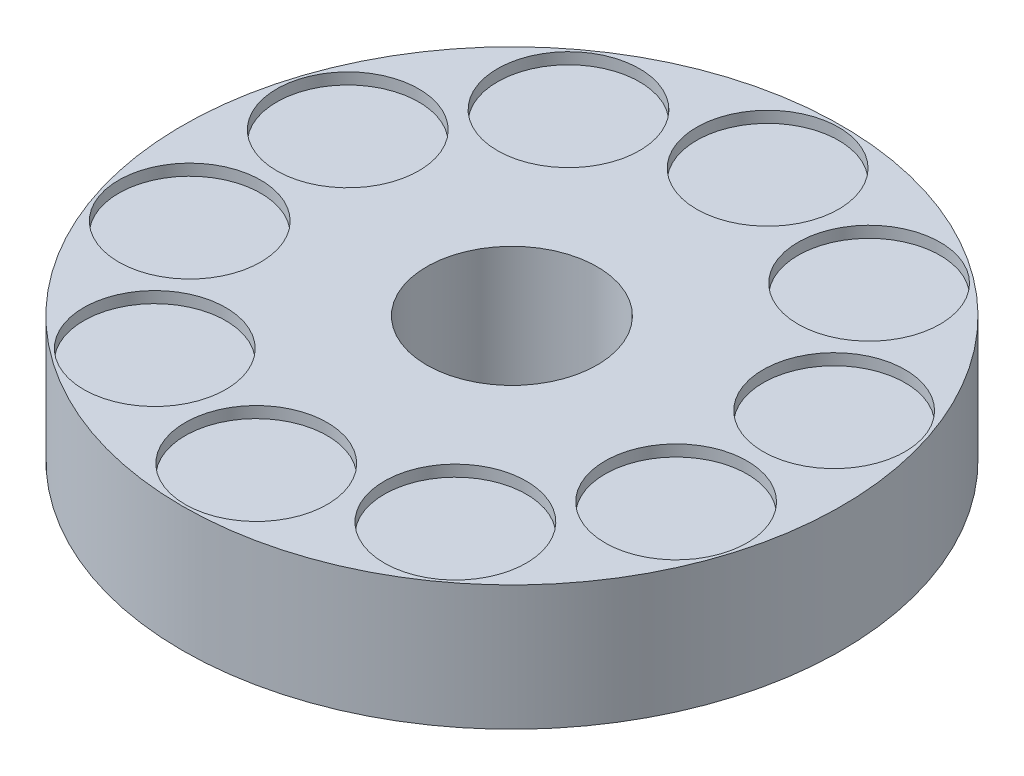
ISO-10303-21;
HEADER;
FILE_DESCRIPTION(('STEP AP214'),'2;1');
FILE_NAME('part.step','',(''),(''),'','','');
FILE_SCHEMA(('AUTOMOTIVE_DESIGN { 1 0 10303 214 1 1 1 1 }'));
ENDSEC;
DATA;
#1=APPLICATION_CONTEXT('core data for automotive mechanical design processes');
#2=APPLICATION_PROTOCOL_DEFINITION('international standard','automotive_design',2000,#1);
#3=PRODUCT_CONTEXT('',#1,'mechanical');
#4=PRODUCT('Part','Part','',(#3));
#5=PRODUCT_RELATED_PRODUCT_CATEGORY('part','',(#4));
#6=PRODUCT_DEFINITION_FORMATION('','',#4);
#7=PRODUCT_DEFINITION_CONTEXT('part definition',#1,'design');
#8=PRODUCT_DEFINITION('design','',#6,#7);
#9=PRODUCT_DEFINITION_SHAPE('','',#8);
#10=(LENGTH_UNIT() NAMED_UNIT(*) SI_UNIT(.MILLI.,.METRE.));
#11=(NAMED_UNIT(*) PLANE_ANGLE_UNIT() SI_UNIT($,.RADIAN.));
#12=(NAMED_UNIT(*) SI_UNIT($,.STERADIAN.) SOLID_ANGLE_UNIT());
#13=UNCERTAINTY_MEASURE_WITH_UNIT(LENGTH_MEASURE(1.E-05),#10,'distance_accuracy_value','');
#14=(GEOMETRIC_REPRESENTATION_CONTEXT(3) GLOBAL_UNCERTAINTY_ASSIGNED_CONTEXT((#13)) GLOBAL_UNIT_ASSIGNED_CONTEXT((#10,
#11,#12)) REPRESENTATION_CONTEXT('',''));
#15=CARTESIAN_POINT('',(0.,0.,0.));
#16=DIRECTION('',(0.,0.,1.));
#17=DIRECTION('',(1.,0.,0.));
#18=AXIS2_PLACEMENT_3D('',#15,#16,#17);
#19=CARTESIAN_POINT('',(0.,6.99999999999999,18.));
#20=DIRECTION('',(0.,-1.,0.));
#21=DIRECTION('',(0.,0.,-1.));
#22=AXIS2_PLACEMENT_3D('',#19,#20,#21);
#23=PLANE('',#22);
#24=CARTESIAN_POINT('',(0.,6.99999999999999,0.));
#25=DIRECTION('',(0.,1.,0.));
#26=DIRECTION('',(0.,0.,1.));
#27=AXIS2_PLACEMENT_3D('',#24,#25,#26);
#28=CIRCLE('',#27,55.);
#29=CARTESIAN_POINT('',(0.,6.99999999999999,55.));
#30=VERTEX_POINT('',#29);
#31=EDGE_CURVE('E357',#30,#30,#28,.T.);
#32=ORIENTED_EDGE('',*,*,#31,.F.);
#33=EDGE_LOOP('',(#32));
#34=FACE_BOUND('',#33,.T.);
#35=DIRECTION('',(0.50000000000001,0.,0.866025403784433));
#36=VECTOR('',#35,1.);
#37=CARTESIAN_POINT('',(-18.2910587012895,6.99999999999999,28.560347664953));
#38=LINE('',#37,#36);
#39=CARTESIAN_POINT('',(-26.8352873353496,7.,13.7613095592766));
#40=VERTEX_POINT('',#39);
#41=CARTESIAN_POINT('',(-25.3352873353496,6.99999999999999,16.3593857706299));
#42=VERTEX_POINT('',#41);
#43=EDGE_CURVE('E48',#40,#42,#38,.T.);
#44=ORIENTED_EDGE('',*,*,#43,.T.);
#45=DIRECTION('',(0.866025403784433,0.,-0.50000000000001));
#46=VECTOR('',#45,1.);
#47=CARTESIAN_POINT('',(-7.04422863406003,6.99999999999999,5.79903810567683));
#48=LINE('',#47,#46);
#49=CARTESIAN_POINT('',(-14.7842363829059,7.,10.2677336630029));
#50=VERTEX_POINT('',#49);
#51=EDGE_CURVE('E168',#42,#50,#48,.T.);
#52=ORIENTED_EDGE('',*,*,#51,.T.);
#53=CARTESIAN_POINT('',(0.,7.,0.));
#54=DIRECTION('',(0.,1.,0.));
#55=DIRECTION('',(0.,0.,1.));
#56=AXIS2_PLACEMENT_3D('',#53,#54,#55);
#57=CIRCLE('',#56,18.);
#58=CARTESIAN_POINT('',(-1.5,7.,17.9373911146521));
#59=VERTEX_POINT('',#58);
#60=EDGE_CURVE('E353',#50,#59,#57,.T.);
#61=ORIENTED_EDGE('',*,*,#60,.T.);
#62=DIRECTION('',(0.,0.,-1.));
#63=VECTOR('',#62,1.);
#64=CARTESIAN_POINT('',(-1.5,6.99999999999999,18.));
#65=LINE('',#64,#63);
#66=CARTESIAN_POINT('',(-1.5,6.99999999999999,30.1206953299058));
#67=VERTEX_POINT('',#66);
#68=EDGE_CURVE('E273',#67,#59,#65,.T.);
#69=ORIENTED_EDGE('',*,*,#68,.F.);
#70=DIRECTION('',(1.,0.,0.));
#71=VECTOR('',#70,1.);
#72=CARTESIAN_POINT('',(0.,6.99999999999999,30.1206953299058));
#73=LINE('',#72,#71);
#74=CARTESIAN_POINT('',(1.5,6.99999999999999,30.1206953299058));
#75=VERTEX_POINT('',#74);
#76=EDGE_CURVE('E282',#67,#75,#73,.T.);
#77=ORIENTED_EDGE('',*,*,#76,.T.);
#78=DIRECTION('',(0.,0.,-1.));
#79=VECTOR('',#78,1.);
#80=CARTESIAN_POINT('',(1.5,6.99999999999999,18.));
#81=LINE('',#80,#79);
#82=CARTESIAN_POINT('',(1.5,7.,17.9373911146521));
#83=VERTEX_POINT('',#82);
#84=EDGE_CURVE('E278',#75,#83,#81,.T.);
#85=ORIENTED_EDGE('',*,*,#84,.T.);
#86=CARTESIAN_POINT('',(14.784236382906,7.,10.2677336630027));
#87=VERTEX_POINT('',#86);
#88=EDGE_CURVE('E354',#83,#87,#57,.T.);
#89=ORIENTED_EDGE('',*,*,#88,.T.);
#90=DIRECTION('',(-0.86602540378444,0.,-0.499999999999998));
#91=VECTOR('',#90,1.);
#92=CARTESIAN_POINT('',(7.04422863405993,6.99999999999999,5.79903810567662));
#93=LINE('',#92,#91);
#94=CARTESIAN_POINT('',(25.3352873353498,7.,16.3593857706295));
#95=VERTEX_POINT('',#94);
#96=EDGE_CURVE('E253',#95,#87,#93,.T.);
#97=ORIENTED_EDGE('',*,*,#96,.F.);
#98=DIRECTION('',(0.499999999999998,0.,-0.86602540378444));
#99=VECTOR('',#98,1.);
#100=CARTESIAN_POINT('',(18.2910587012899,6.99999999999999,28.5603476649529));
#101=LINE('',#100,#99);
#102=CARTESIAN_POINT('',(26.8352873353498,6.99999999999999,13.7613095592762));
#103=VERTEX_POINT('',#102);
#104=EDGE_CURVE('E262',#95,#103,#101,.T.);
#105=ORIENTED_EDGE('',*,*,#104,.T.);
#106=DIRECTION('',(-0.86602540378444,0.,-0.499999999999998));
#107=VECTOR('',#106,1.);
#108=CARTESIAN_POINT('',(8.54422863405992,6.99999999999999,3.2009618943233));
#109=LINE('',#108,#107);
#110=CARTESIAN_POINT('',(16.284236382906,7.,7.66965745164935));
#111=VERTEX_POINT('',#110);
#112=EDGE_CURVE('E258',#103,#111,#109,.T.);
#113=ORIENTED_EDGE('',*,*,#112,.T.);
#114=CARTESIAN_POINT('',(16.2842363829059,7.,-7.66965745164946));
#115=VERTEX_POINT('',#114);
#116=EDGE_CURVE('E358',#111,#115,#57,.T.);
#117=ORIENTED_EDGE('',*,*,#116,.T.);
#118=DIRECTION('',(-0.866025403784436,0.,0.500000000000004));
#119=VECTOR('',#118,1.);
#120=CARTESIAN_POINT('',(-7.04422863405998,6.99999999999999,5.79903810567672));
#121=LINE('',#120,#119);
#122=CARTESIAN_POINT('',(26.8352873353497,6.99999999999999,-13.7613095592764));
#123=VERTEX_POINT('',#122);
#124=EDGE_CURVE('E233',#123,#115,#121,.T.);
#125=ORIENTED_EDGE('',*,*,#124,.F.);
#126=DIRECTION('',(-0.500000000000004,0.,-0.866025403784436));
#127=VECTOR('',#126,1.);
#128=CARTESIAN_POINT('',(33.8795159694097,6.99999999999999,-1.56034766495312));
#129=LINE('',#128,#127);
#130=CARTESIAN_POINT('',(25.3352873353497,6.99999999999999,-16.3593857706297));
#131=VERTEX_POINT('',#130);
#132=EDGE_CURVE('E242',#123,#131,#129,.T.);
#133=ORIENTED_EDGE('',*,*,#132,.T.);
#134=DIRECTION('',(-0.866025403784436,0.,0.500000000000004));
#135=VECTOR('',#134,1.);
#136=CARTESIAN_POINT('',(-8.54422863405999,6.99999999999999,3.20096189432341));
#137=LINE('',#136,#135);
#138=CARTESIAN_POINT('',(14.7842363829059,7.,-10.2677336630028));
#139=VERTEX_POINT('',#138);
#140=EDGE_CURVE('E238',#131,#139,#137,.T.);
#141=ORIENTED_EDGE('',*,*,#140,.T.);
#142=CARTESIAN_POINT('',(1.5,7.,-17.9373911146521));
#143=VERTEX_POINT('',#142);
#144=EDGE_CURVE('E553',#139,#143,#57,.T.);
#145=ORIENTED_EDGE('',*,*,#144,.T.);
#146=DIRECTION('',(0.,0.,1.));
#147=VECTOR('',#146,1.);
#148=CARTESIAN_POINT('',(1.5,6.99999999999999,18.));
#149=LINE('',#148,#147);
#150=CARTESIAN_POINT('',(1.5,6.99999999999999,-30.1206953299058));
#151=VERTEX_POINT('',#150);
#152=EDGE_CURVE('E213',#151,#143,#149,.T.);
#153=ORIENTED_EDGE('',*,*,#152,.F.);
#154=DIRECTION('',(-1.,0.,0.));
#155=VECTOR('',#154,1.);
#156=CARTESIAN_POINT('',(0.,6.99999999999999,-30.1206953299058));
#157=LINE('',#156,#155);
#158=CARTESIAN_POINT('',(-1.5,6.99999999999999,-30.1206953299058));
#159=VERTEX_POINT('',#158);
#160=EDGE_CURVE('E222',#151,#159,#157,.T.);
#161=ORIENTED_EDGE('',*,*,#160,.T.);
#162=DIRECTION('',(0.,0.,1.));
#163=VECTOR('',#162,1.);
#164=CARTESIAN_POINT('',(-1.5,6.99999999999999,18.));
#165=LINE('',#164,#163);
#166=CARTESIAN_POINT('',(-1.5,7.,-17.9373911146521));
#167=VERTEX_POINT('',#166);
#168=EDGE_CURVE('E218',#159,#167,#165,.T.);
#169=ORIENTED_EDGE('',*,*,#168,.T.);
#170=CARTESIAN_POINT('',(-14.7842363829061,7.,-10.2677336630026));
#171=VERTEX_POINT('',#170);
#172=EDGE_CURVE('E551',#167,#171,#57,.T.);
#173=ORIENTED_EDGE('',*,*,#172,.T.);
#174=DIRECTION('',(0.866025403784443,0.,0.499999999999992));
#175=VECTOR('',#174,1.);
#176=CARTESIAN_POINT('',(8.54422863405985,6.99999999999999,3.20096189432319));
#177=LINE('',#176,#175);
#178=CARTESIAN_POINT('',(-25.3352873353499,7.,-16.3593857706293));
#179=VERTEX_POINT('',#178);
#180=EDGE_CURVE('E193',#179,#171,#177,.T.);
#181=ORIENTED_EDGE('',*,*,#180,.F.);
#182=DIRECTION('',(-0.499999999999992,0.,0.866025403784443));
#183=VECTOR('',#182,1.);
#184=CARTESIAN_POINT('',(-33.8795159694098,6.99999999999999,-1.56034766495254));
#185=LINE('',#184,#183);
#186=CARTESIAN_POINT('',(-26.8352873353499,6.99999999999999,-13.761309559276));
#187=VERTEX_POINT('',#186);
#188=EDGE_CURVE('E202',#179,#187,#185,.T.);
#189=ORIENTED_EDGE('',*,*,#188,.T.);
#190=DIRECTION('',(0.866025403784443,0.,0.499999999999992));
#191=VECTOR('',#190,1.);
#192=CARTESIAN_POINT('',(7.04422863405987,6.99999999999999,5.79903810567652));
#193=LINE('',#192,#191);
#194=CARTESIAN_POINT('',(-16.284236382906,7.,-7.66965745164924));
#195=VERTEX_POINT('',#194);
#196=EDGE_CURVE('E198',#187,#195,#193,.T.);
#197=ORIENTED_EDGE('',*,*,#196,.T.);
#198=CARTESIAN_POINT('',(-16.2842363829059,7.,7.66965745164958));
#199=VERTEX_POINT('',#198);
#200=EDGE_CURVE('E550',#195,#199,#57,.T.);
#201=ORIENTED_EDGE('',*,*,#200,.T.);
#202=DIRECTION('',(0.866025403784433,0.,-0.50000000000001));
#203=VECTOR('',#202,1.);
#204=CARTESIAN_POINT('',(-8.54422863406006,6.99999999999999,3.20096189432353));
#205=LINE('',#204,#203);
#206=EDGE_CURVE('E53',#40,#199,#205,.T.);
#207=ORIENTED_EDGE('',*,*,#206,.F.);
#208=EDGE_LOOP('',(#44,#52,#61,#69,#77,#85,#89,#97,#105,#113,#117,#125,#133,#141,#145,#153,#161,
#169,#173,#181,#189,#197,#201,#207));
#209=FACE_BOUND('',#208,.T.);
#210=ADVANCED_FACE('F33',(#34,#209),#23,.T.);
#211=CARTESIAN_POINT('',(0.,42.6401700106534,0.));
#212=DIRECTION('',(0.,1.,0.));
#213=DIRECTION('',(0.,0.,1.));
#214=AXIS2_PLACEMENT_3D('',#211,#212,#213);
#215=CYLINDRICAL_SURFACE('',#214,18.);
#216=CARTESIAN_POINT('',(0.,-11.,0.));
#217=DIRECTION('',(0.,1.,0.));
#218=DIRECTION('',(0.,0.,1.));
#219=AXIS2_PLACEMENT_3D('',#216,#217,#218);
#220=CIRCLE('',#219,18.);
#221=CARTESIAN_POINT('',(0.,-11.,18.));
#222=VERTEX_POINT('',#221);
#223=EDGE_CURVE('E350',#222,#222,#220,.T.);
#224=ORIENTED_EDGE('',*,*,#223,.T.);
#225=EDGE_LOOP('',(#224));
#226=FACE_BOUND('',#225,.T.);
#227=ORIENTED_EDGE('',*,*,#60,.F.);
#228=DIRECTION('',(0.,1.,0.));
#229=VECTOR('',#228,1.);
#230=CARTESIAN_POINT('',(-14.7842363829059,42.6401700106534,10.2677336630029));
#231=LINE('',#230,#229);
#232=CARTESIAN_POINT('',(-14.7842363829059,-9.24440562033832,10.2677336630029));
#233=VERTEX_POINT('',#232);
#234=EDGE_CURVE('E163',#50,#233,#231,.F.);
#235=ORIENTED_EDGE('',*,*,#234,.T.);
#236=CARTESIAN_POINT('',(0.,-33.1609271065411,0.));
#237=DIRECTION('',(0.692820323027546,0.6,-0.400000000000008));
#238=DIRECTION('',(-0.51961524227066,0.8,0.300000000000006));
#239=AXIS2_PLACEMENT_3D('',#236,#237,#238);
#240=ELLIPSE('',#239,30.,18.);
#241=CARTESIAN_POINT('',(-16.2842363829059,-9.24440562033834,7.66965745164958));
#242=VERTEX_POINT('',#241);
#243=EDGE_CURVE('E156',#233,#242,#240,.F.);
#244=ORIENTED_EDGE('',*,*,#243,.T.);
#245=DIRECTION('',(0.,1.,0.));
#246=VECTOR('',#245,1.);
#247=CARTESIAN_POINT('',(-16.2842363829059,42.6401700106534,7.66965745164958));
#248=LINE('',#247,#246);
#249=EDGE_CURVE('E161',#199,#242,#248,.F.);
#250=ORIENTED_EDGE('',*,*,#249,.F.);
#251=ORIENTED_EDGE('',*,*,#200,.F.);
#252=DIRECTION('',(0.,1.,0.));
#253=VECTOR('',#252,1.);
#254=CARTESIAN_POINT('',(-16.284236382906,42.6401700106534,-7.66965745164924));
#255=LINE('',#254,#253);
#256=CARTESIAN_POINT('',(-16.2842363829061,-9.24440562033834,-7.66965745164924));
#257=VERTEX_POINT('',#256);
#258=EDGE_CURVE('E196',#195,#257,#255,.F.);
#259=ORIENTED_EDGE('',*,*,#258,.T.);
#260=CARTESIAN_POINT('',(0.,-33.1609271065411,0.));
#261=DIRECTION('',(0.692820323027555,0.6,0.399999999999994));
#262=DIRECTION('',(-0.519615242270666,0.8,-0.299999999999995));
#263=AXIS2_PLACEMENT_3D('',#260,#261,#262);
#264=ELLIPSE('',#263,30.,18.);
#265=CARTESIAN_POINT('',(-14.7842363829061,-9.24440562033834,-10.2677336630026));
#266=VERTEX_POINT('',#265);
#267=EDGE_CURVE('E200',#257,#266,#264,.F.);
#268=ORIENTED_EDGE('',*,*,#267,.T.);
#269=DIRECTION('',(0.,1.,0.));
#270=VECTOR('',#269,1.);
#271=CARTESIAN_POINT('',(-14.7842363829061,42.6401700106534,-10.2677336630026));
#272=LINE('',#271,#270);
#273=EDGE_CURVE('E188',#171,#266,#272,.F.);
#274=ORIENTED_EDGE('',*,*,#273,.F.);
#275=ORIENTED_EDGE('',*,*,#172,.F.);
#276=DIRECTION('',(0.,1.,0.));
#277=VECTOR('',#276,1.);
#278=CARTESIAN_POINT('',(-1.5,42.6401700106534,-17.9373911146521));
#279=LINE('',#278,#277);
#280=CARTESIAN_POINT('',(-1.5,-9.24440562033834,-17.9373911146521));
#281=VERTEX_POINT('',#280);
#282=EDGE_CURVE('E216',#167,#281,#279,.F.);
#283=ORIENTED_EDGE('',*,*,#282,.T.);
#284=CARTESIAN_POINT('',(0.,-33.1609271065411,0.));
#285=DIRECTION('',(0.,0.6,0.8));
#286=DIRECTION('',(0.,0.8,-0.6));
#287=AXIS2_PLACEMENT_3D('',#284,#285,#286);
#288=ELLIPSE('',#287,30.,18.);
#289=CARTESIAN_POINT('',(1.5,-9.24440562033835,-17.9373911146521));
#290=VERTEX_POINT('',#289);
#291=EDGE_CURVE('E220',#281,#290,#288,.F.);
#292=ORIENTED_EDGE('',*,*,#291,.T.);
#293=DIRECTION('',(0.,1.,0.));
#294=VECTOR('',#293,1.);
#295=CARTESIAN_POINT('',(1.5,42.6401700106534,-17.9373911146521));
#296=LINE('',#295,#294);
#297=EDGE_CURVE('E208',#143,#290,#296,.F.);
#298=ORIENTED_EDGE('',*,*,#297,.F.);
#299=ORIENTED_EDGE('',*,*,#144,.F.);
#300=DIRECTION('',(0.,1.,0.));
#301=VECTOR('',#300,1.);
#302=CARTESIAN_POINT('',(14.7842363829059,42.6401700106534,-10.2677336630028));
#303=LINE('',#302,#301);
#304=CARTESIAN_POINT('',(14.7842363829059,-9.24440562033833,-10.2677336630028));
#305=VERTEX_POINT('',#304);
#306=EDGE_CURVE('E236',#139,#305,#303,.F.);
#307=ORIENTED_EDGE('',*,*,#306,.T.);
#308=CARTESIAN_POINT('',(0.,-33.1609271065411,0.));
#309=DIRECTION('',(-0.692820323027549,0.6,0.400000000000003));
#310=DIRECTION('',(0.519615242270662,0.8,-0.300000000000002));
#311=AXIS2_PLACEMENT_3D('',#308,#309,#310);
#312=ELLIPSE('',#311,30.,18.);
#313=CARTESIAN_POINT('',(16.2842363829059,-9.24440562033835,-7.66965745164946));
#314=VERTEX_POINT('',#313);
#315=EDGE_CURVE('E240',#305,#314,#312,.F.);
#316=ORIENTED_EDGE('',*,*,#315,.T.);
#317=DIRECTION('',(0.,1.,0.));
#318=VECTOR('',#317,1.);
#319=CARTESIAN_POINT('',(16.2842363829059,42.6401700106534,-7.66965745164946));
#320=LINE('',#319,#318);
#321=EDGE_CURVE('E228',#115,#314,#320,.F.);
#322=ORIENTED_EDGE('',*,*,#321,.F.);
#323=ORIENTED_EDGE('',*,*,#116,.F.);
#324=DIRECTION('',(0.,1.,0.));
#325=VECTOR('',#324,1.);
#326=CARTESIAN_POINT('',(16.284236382906,42.6401700106534,7.66965745164935));
#327=LINE('',#326,#325);
#328=CARTESIAN_POINT('',(16.284236382906,-9.24440562033832,7.66965745164936));
#329=VERTEX_POINT('',#328);
#330=EDGE_CURVE('E256',#111,#329,#327,.F.);
#331=ORIENTED_EDGE('',*,*,#330,.T.);
#332=CARTESIAN_POINT('',(0.,-33.1609271065411,0.));
#333=DIRECTION('',(-0.692820323027552,0.6,-0.399999999999998));
#334=DIRECTION('',(0.519615242270664,0.8,0.299999999999999));
#335=AXIS2_PLACEMENT_3D('',#332,#333,#334);
#336=ELLIPSE('',#335,30.,18.);
#337=CARTESIAN_POINT('',(14.784236382906,-9.24440562033835,10.2677336630027));
#338=VERTEX_POINT('',#337);
#339=EDGE_CURVE('E260',#329,#338,#336,.F.);
#340=ORIENTED_EDGE('',*,*,#339,.T.);
#341=DIRECTION('',(0.,1.,0.));
#342=VECTOR('',#341,1.);
#343=CARTESIAN_POINT('',(14.784236382906,42.6401700106534,10.2677336630027));
#344=LINE('',#343,#342);
#345=EDGE_CURVE('E248',#87,#338,#344,.F.);
#346=ORIENTED_EDGE('',*,*,#345,.F.);
#347=ORIENTED_EDGE('',*,*,#88,.F.);
#348=DIRECTION('',(0.,1.,0.));
#349=VECTOR('',#348,1.);
#350=CARTESIAN_POINT('',(1.5,42.6401700106534,17.9373911146521));
#351=LINE('',#350,#349);
#352=CARTESIAN_POINT('',(1.5,-9.24440562033834,17.9373911146521));
#353=VERTEX_POINT('',#352);
#354=EDGE_CURVE('E276',#83,#353,#351,.F.);
#355=ORIENTED_EDGE('',*,*,#354,.T.);
#356=CARTESIAN_POINT('',(0.,-33.1609271065411,0.));
#357=DIRECTION('',(0.,0.6,-0.8));
#358=DIRECTION('',(0.,0.8,0.6));
#359=AXIS2_PLACEMENT_3D('',#356,#357,#358);
#360=ELLIPSE('',#359,30.,18.);
#361=CARTESIAN_POINT('',(-1.5,-9.24440562033835,17.9373911146521));
#362=VERTEX_POINT('',#361);
#363=EDGE_CURVE('E280',#353,#362,#360,.F.);
#364=ORIENTED_EDGE('',*,*,#363,.T.);
#365=DIRECTION('',(0.,1.,0.));
#366=VECTOR('',#365,1.);
#367=CARTESIAN_POINT('',(-1.5,42.6401700106534,17.9373911146521));
#368=LINE('',#367,#366);
#369=EDGE_CURVE('E268',#59,#362,#368,.F.);
#370=ORIENTED_EDGE('',*,*,#369,.F.);
#371=EDGE_LOOP('',(#227,#235,#244,#250,#251,#259,#268,#274,#275,#283,#292,#298,#299,#307,#316,
#322,#323,#331,#340,#346,#347,#355,#364,#370));
#372=FACE_BOUND('',#371,.T.);
#373=ADVANCED_FACE('F159',(#226,#372),#215,.T.);
#374=CARTESIAN_POINT('',(0.,42.6401700106534,0.));
#375=DIRECTION('',(0.,1.,0.));
#376=DIRECTION('',(0.,0.,1.));
#377=AXIS2_PLACEMENT_3D('',#374,#375,#376);
#378=CYLINDRICAL_SURFACE('',#377,58.);
#379=CARTESIAN_POINT('',(0.,-11.,0.));
#380=DIRECTION('',(0.,1.,0.));
#381=DIRECTION('',(0.,0.,1.));
#382=AXIS2_PLACEMENT_3D('',#379,#380,#381);
#383=CIRCLE('',#382,58.);
#384=CARTESIAN_POINT('',(0.,-11.,58.));
#385=VERTEX_POINT('',#384);
#386=EDGE_CURVE('E41',#385,#385,#383,.T.);
#387=ORIENTED_EDGE('',*,*,#386,.T.);
#388=EDGE_LOOP('',(#387));
#389=FACE_BOUND('',#388,.T.);
#390=CARTESIAN_POINT('',(0.,11.,0.));
#391=DIRECTION('',(0.,1.,0.));
#392=DIRECTION('',(0.,0.,1.));
#393=AXIS2_PLACEMENT_3D('',#390,#391,#392);
#394=CIRCLE('',#393,58.);
#395=CARTESIAN_POINT('',(0.,11.,58.));
#396=VERTEX_POINT('',#395);
#397=EDGE_CURVE('E11',#396,#396,#394,.T.);
#398=ORIENTED_EDGE('',*,*,#397,.F.);
#399=EDGE_LOOP('',(#398));
#400=FACE_BOUND('',#399,.T.);
#401=ADVANCED_FACE('F35',(#389,#400),#378,.T.);
#402=CARTESIAN_POINT('',(0.,-11.,58.));
#403=DIRECTION('',(0.,-1.,0.));
#404=DIRECTION('',(0.,0.,-1.));
#405=AXIS2_PLACEMENT_3D('',#402,#403,#404);
#406=PLANE('',#405);
#407=CARTESIAN_POINT('',(0.,-11.,0.));
#408=DIRECTION('',(0.,1.,0.));
#409=DIRECTION('',(0.,0.,1.));
#410=AXIS2_PLACEMENT_3D('',#407,#408,#409);
#411=CIRCLE('',#410,55.);
#412=CARTESIAN_POINT('',(0.,-11.,55.));
#413=VERTEX_POINT('',#412);
#414=EDGE_CURVE('E361',#413,#413,#411,.T.);
#415=ORIENTED_EDGE('',*,*,#414,.T.);
#416=EDGE_LOOP('',(#415));
#417=FACE_BOUND('',#416,.T.);
#418=ORIENTED_EDGE('',*,*,#386,.F.);
#419=EDGE_LOOP('',(#418));
#420=FACE_BOUND('',#419,.T.);
#421=ADVANCED_FACE('F368',(#417,#420),#406,.T.);
#422=CARTESIAN_POINT('',(0.,42.6401700106534,0.));
#423=DIRECTION('',(0.,1.,0.));
#424=DIRECTION('',(0.,0.,1.));
#425=AXIS2_PLACEMENT_3D('',#422,#423,#424);
#426=CYLINDRICAL_SURFACE('',#425,55.);
#427=ORIENTED_EDGE('',*,*,#31,.T.);
#428=EDGE_LOOP('',(#427));
#429=FACE_BOUND('',#428,.T.);
#430=ORIENTED_EDGE('',*,*,#414,.F.);
#431=EDGE_LOOP('',(#430));
#432=FACE_BOUND('',#431,.T.);
#433=ADVANCED_FACE('F370',(#429,#432),#426,.F.);
#434=CARTESIAN_POINT('',(0.,-11.,15.));
#435=DIRECTION('',(0.,-1.,0.));
#436=DIRECTION('',(0.,0.,-1.));
#437=AXIS2_PLACEMENT_3D('',#434,#435,#436);
#438=PLANE('',#437);
#439=CARTESIAN_POINT('',(0.,-11.,0.));
#440=DIRECTION('',(0.,1.,0.));
#441=DIRECTION('',(0.,0.,1.));
#442=AXIS2_PLACEMENT_3D('',#439,#440,#441);
#443=CIRCLE('',#442,15.);
#444=CARTESIAN_POINT('',(0.,-11.,15.));
#445=VERTEX_POINT('',#444);
#446=EDGE_CURVE('E347',#445,#445,#443,.T.);
#447=ORIENTED_EDGE('',*,*,#446,.T.);
#448=EDGE_LOOP('',(#447));
#449=FACE_BOUND('',#448,.T.);
#450=ORIENTED_EDGE('',*,*,#223,.F.);
#451=EDGE_LOOP('',(#450));
#452=FACE_BOUND('',#451,.T.);
#453=ADVANCED_FACE('F376',(#449,#452),#438,.T.);
#454=CARTESIAN_POINT('',(0.,42.6401700106534,0.));
#455=DIRECTION('',(0.,1.,0.));
#456=DIRECTION('',(0.,0.,1.));
#457=AXIS2_PLACEMENT_3D('',#454,#455,#456);
#458=CYLINDRICAL_SURFACE('',#457,15.);
#459=CARTESIAN_POINT('',(0.,11.,0.));
#460=DIRECTION('',(0.,1.,0.));
#461=DIRECTION('',(0.,0.,1.));
#462=AXIS2_PLACEMENT_3D('',#459,#460,#461);
#463=CIRCLE('',#462,15.);
#464=CARTESIAN_POINT('',(0.,11.,15.));
#465=VERTEX_POINT('',#464);
#466=EDGE_CURVE('E342',#465,#465,#463,.T.);
#467=ORIENTED_EDGE('',*,*,#466,.T.);
#468=EDGE_LOOP('',(#467));
#469=FACE_BOUND('',#468,.T.);
#470=ORIENTED_EDGE('',*,*,#446,.F.);
#471=EDGE_LOOP('',(#470));
#472=FACE_BOUND('',#471,.T.);
#473=ADVANCED_FACE('F391',(#469,#472),#458,.F.);
#474=CARTESIAN_POINT('',(0.,11.,45.));
#475=DIRECTION('',(0.,1.,0.));
#476=DIRECTION('',(0.,0.,1.));
#477=AXIS2_PLACEMENT_3D('',#474,#475,#476);
#478=PLANE('',#477);
#479=CARTESIAN_POINT('',(42.7975432332842,11.,-13.9057647468758));
#480=DIRECTION('',(0.,1.,0.));
#481=DIRECTION('',(0.,0.,1.));
#482=AXIS2_PLACEMENT_3D('',#479,#480,#481);
#483=CIRCLE('',#482,12.5);
#484=CARTESIAN_POINT('',(42.7975432332842,11.,-1.4057647468758));
#485=VERTEX_POINT('',#484);
#486=EDGE_CURVE('E295',#485,#485,#483,.T.);
#487=ORIENTED_EDGE('',*,*,#486,.F.);
#488=EDGE_LOOP('',(#487));
#489=FACE_BOUND('',#488,.T.);
#490=CARTESIAN_POINT('',(26.4503363531619,11.,-36.4057647468746));
#491=DIRECTION('',(0.,1.,0.));
#492=DIRECTION('',(0.,0.,1.));
#493=AXIS2_PLACEMENT_3D('',#490,#491,#492);
#494=CIRCLE('',#493,12.5);
#495=CARTESIAN_POINT('',(26.4503363531619,11.,-23.9057647468746));
#496=VERTEX_POINT('',#495);
#497=EDGE_CURVE('E294',#496,#496,#494,.T.);
#498=ORIENTED_EDGE('',*,*,#497,.F.);
#499=EDGE_LOOP('',(#498));
#500=FACE_BOUND('',#499,.T.);
#501=CARTESIAN_POINT('',(26.4503363531673,11.,36.4057647468707));
#502=DIRECTION('',(0.,1.,0.));
#503=DIRECTION('',(0.,0.,1.));
#504=AXIS2_PLACEMENT_3D('',#501,#502,#503);
#505=CIRCLE('',#504,12.5);
#506=CARTESIAN_POINT('',(26.4503363531673,11.,48.9057647468707));
#507=VERTEX_POINT('',#506);
#508=EDGE_CURVE('E309',#507,#507,#505,.T.);
#509=ORIENTED_EDGE('',*,*,#508,.F.);
#510=EDGE_LOOP('',(#509));
#511=FACE_BOUND('',#510,.T.);
#512=CARTESIAN_POINT('',(42.7975432332863,11.,13.9057647468695));
#513=DIRECTION('',(0.,1.,0.));
#514=DIRECTION('',(0.,0.,1.));
#515=AXIS2_PLACEMENT_3D('',#512,#513,#514);
#516=CIRCLE('',#515,12.5);
#517=CARTESIAN_POINT('',(42.7975432332863,11.,26.4057647468695));
#518=VERTEX_POINT('',#517);
#519=EDGE_CURVE('E308',#518,#518,#516,.T.);
#520=ORIENTED_EDGE('',*,*,#519,.F.);
#521=EDGE_LOOP('',(#520));
#522=FACE_BOUND('',#521,.T.);
#523=CARTESIAN_POINT('',(-42.7975432332796,11.,-13.9057647468695));
#524=DIRECTION('',(0.,1.,0.));
#525=DIRECTION('',(0.,0.,1.));
#526=AXIS2_PLACEMENT_3D('',#523,#524,#525);
#527=CIRCLE('',#526,12.5);
#528=CARTESIAN_POINT('',(-42.7975432332796,11.,-1.40576474686946));
#529=VERTEX_POINT('',#528);
#530=EDGE_CURVE('E288',#529,#529,#527,.T.);
#531=ORIENTED_EDGE('',*,*,#530,.F.);
#532=EDGE_LOOP('',(#531));
#533=FACE_BOUND('',#532,.T.);
#534=CARTESIAN_POINT('',(-42.7975432332776,11.,13.9057647468758));
#535=DIRECTION('',(0.,1.,0.));
#536=DIRECTION('',(0.,0.,1.));
#537=AXIS2_PLACEMENT_3D('',#534,#535,#536);
#538=CIRCLE('',#537,12.5);
#539=CARTESIAN_POINT('',(-42.7975432332776,11.,26.4057647468758));
#540=VERTEX_POINT('',#539);
#541=EDGE_CURVE('E321',#540,#540,#538,.T.);
#542=ORIENTED_EDGE('',*,*,#541,.F.);
#543=EDGE_LOOP('',(#542));
#544=FACE_BOUND('',#543,.T.);
#545=CARTESIAN_POINT('',(-26.4503363531553,11.,36.4057647468746));
#546=DIRECTION('',(0.,1.,0.));
#547=DIRECTION('',(0.,0.,1.));
#548=AXIS2_PLACEMENT_3D('',#545,#546,#547);
#549=CIRCLE('',#548,12.5);
#550=CARTESIAN_POINT('',(-26.4503363531553,11.,48.9057647468746));
#551=VERTEX_POINT('',#550);
#552=EDGE_CURVE('E320',#551,#551,#549,.T.);
#553=ORIENTED_EDGE('',*,*,#552,.F.);
#554=EDGE_LOOP('',(#553));
#555=FACE_BOUND('',#554,.T.);
#556=CARTESIAN_POINT('',(6.65358252734772E-12,11.,45.));
#557=DIRECTION('',(0.,1.,0.));
#558=DIRECTION('',(0.,0.,1.));
#559=AXIS2_PLACEMENT_3D('',#556,#557,#558);
#560=CIRCLE('',#559,12.5);
#561=CARTESIAN_POINT('',(6.65358252734772E-12,11.,57.5));
#562=VERTEX_POINT('',#561);
#563=EDGE_CURVE('E331',#562,#562,#560,.T.);
#564=ORIENTED_EDGE('',*,*,#563,.F.);
#565=EDGE_LOOP('',(#564));
#566=FACE_BOUND('',#565,.T.);
#567=CARTESIAN_POINT('',(-26.4503363531607,11.,-36.4057647468707));
#568=DIRECTION('',(0.,1.,0.));
#569=DIRECTION('',(0.,0.,1.));
#570=AXIS2_PLACEMENT_3D('',#567,#568,#569);
#571=CIRCLE('',#570,12.5);
#572=CARTESIAN_POINT('',(-26.4503363531607,11.,-23.9057647468707));
#573=VERTEX_POINT('',#572);
#574=EDGE_CURVE('E284',#573,#573,#571,.T.);
#575=ORIENTED_EDGE('',*,*,#574,.F.);
#576=EDGE_LOOP('',(#575));
#577=FACE_BOUND('',#576,.T.);
#578=CARTESIAN_POINT('',(0.,11.,-45.));
#579=DIRECTION('',(0.,1.,0.));
#580=DIRECTION('',(0.,0.,1.));
#581=AXIS2_PLACEMENT_3D('',#578,#579,#580);
#582=CIRCLE('',#581,12.5);
#583=CARTESIAN_POINT('',(0.,11.,-32.5));
#584=VERTEX_POINT('',#583);
#585=EDGE_CURVE('E302',#584,#584,#582,.T.);
#586=ORIENTED_EDGE('',*,*,#585,.F.);
#587=EDGE_LOOP('',(#586));
#588=FACE_BOUND('',#587,.T.);
#589=ORIENTED_EDGE('',*,*,#397,.T.);
#590=EDGE_LOOP('',(#589));
#591=FACE_BOUND('',#590,.T.);
#592=ORIENTED_EDGE('',*,*,#466,.F.);
#593=EDGE_LOOP('',(#592));
#594=FACE_BOUND('',#593,.T.);
#595=ADVANCED_FACE('F395',(#489,#500,#511,#522,#533,#544,#555,#566,#577,#588,#591,#594),#478,.T.);
#596=CARTESIAN_POINT('',(0.,8.99999999999999,-45.));
#597=DIRECTION('',(0.,1.,0.));
#598=DIRECTION('',(0.,0.,1.));
#599=AXIS2_PLACEMENT_3D('',#596,#597,#598);
#600=CYLINDRICAL_SURFACE('',#599,12.5);
#601=CARTESIAN_POINT('',(0.,8.99999999999999,-45.));
#602=DIRECTION('',(0.,1.,0.));
#603=DIRECTION('',(0.,0.,1.));
#604=AXIS2_PLACEMENT_3D('',#601,#602,#603);
#605=CIRCLE('',#604,12.5);
#606=CARTESIAN_POINT('',(0.,8.99999999999999,-32.5));
#607=VERTEX_POINT('',#606);
#608=EDGE_CURVE('E339',#607,#607,#605,.T.);
#609=ORIENTED_EDGE('',*,*,#608,.F.);
#610=EDGE_LOOP('',(#609));
#611=FACE_BOUND('',#610,.T.);
#612=ORIENTED_EDGE('',*,*,#585,.T.);
#613=EDGE_LOOP('',(#612));
#614=FACE_BOUND('',#613,.T.);
#615=ADVANCED_FACE('F399',(#611,#614),#600,.F.);
#616=CARTESIAN_POINT('',(0.,8.99999999999999,-45.));
#617=DIRECTION('',(0.,1.,0.));
#618=DIRECTION('',(0.,0.,1.));
#619=AXIS2_PLACEMENT_3D('',#616,#617,#618);
#620=PLANE('',#619);
#621=ORIENTED_EDGE('',*,*,#608,.T.);
#622=EDGE_LOOP('',(#621));
#623=FACE_BOUND('',#622,.T.);
#624=ADVANCED_FACE('F403',(#623),#620,.T.);
#625=CARTESIAN_POINT('',(-26.4503363531607,8.99999999999999,-36.4057647468707));
#626=DIRECTION('',(0.,1.,0.));
#627=DIRECTION('',(0.,0.,1.));
#628=AXIS2_PLACEMENT_3D('',#625,#626,#627);
#629=CYLINDRICAL_SURFACE('',#628,12.5);
#630=CARTESIAN_POINT('',(-26.4503363531607,8.99999999999999,-36.4057647468707));
#631=DIRECTION('',(0.,1.,0.));
#632=DIRECTION('',(0.,0.,1.));
#633=AXIS2_PLACEMENT_3D('',#630,#631,#632);
#634=CIRCLE('',#633,12.5);
#635=CARTESIAN_POINT('',(-26.4503363531607,8.99999999999999,-23.9057647468707));
#636=VERTEX_POINT('',#635);
#637=EDGE_CURVE('E285',#636,#636,#634,.T.);
#638=ORIENTED_EDGE('',*,*,#637,.F.);
#639=EDGE_LOOP('',(#638));
#640=FACE_BOUND('',#639,.T.);
#641=ORIENTED_EDGE('',*,*,#574,.T.);
#642=EDGE_LOOP('',(#641));
#643=FACE_BOUND('',#642,.T.);
#644=ADVANCED_FACE('F407',(#640,#643),#629,.F.);
#645=CARTESIAN_POINT('',(-26.4503363531607,8.99999999999999,-36.4057647468707));
#646=DIRECTION('',(0.,1.,0.));
#647=DIRECTION('',(0.,0.,1.));
#648=AXIS2_PLACEMENT_3D('',#645,#646,#647);
#649=PLANE('',#648);
#650=ORIENTED_EDGE('',*,*,#637,.T.);
#651=EDGE_LOOP('',(#650));
#652=FACE_BOUND('',#651,.T.);
#653=ADVANCED_FACE('F422',(#652),#649,.T.);
#654=CARTESIAN_POINT('',(6.65358252734772E-12,8.99999999999999,45.));
#655=DIRECTION('',(0.,1.,0.));
#656=DIRECTION('',(0.,0.,1.));
#657=AXIS2_PLACEMENT_3D('',#654,#655,#656);
#658=CYLINDRICAL_SURFACE('',#657,12.5);
#659=CARTESIAN_POINT('',(6.65358252734772E-12,8.99999999999999,45.));
#660=DIRECTION('',(0.,1.,0.));
#661=DIRECTION('',(0.,0.,1.));
#662=AXIS2_PLACEMENT_3D('',#659,#660,#661);
#663=CIRCLE('',#662,12.5);
#664=CARTESIAN_POINT('',(6.65358252734772E-12,8.99999999999999,57.5));
#665=VERTEX_POINT('',#664);
#666=EDGE_CURVE('E312',#665,#665,#663,.T.);
#667=ORIENTED_EDGE('',*,*,#666,.F.);
#668=EDGE_LOOP('',(#667));
#669=FACE_BOUND('',#668,.T.);
#670=ORIENTED_EDGE('',*,*,#563,.T.);
#671=EDGE_LOOP('',(#670));
#672=FACE_BOUND('',#671,.T.);
#673=ADVANCED_FACE('F419',(#669,#672),#658,.F.);
#674=CARTESIAN_POINT('',(6.65358252734772E-12,8.99999999999999,45.));
#675=DIRECTION('',(0.,1.,0.));
#676=DIRECTION('',(0.,0.,1.));
#677=AXIS2_PLACEMENT_3D('',#674,#675,#676);
#678=PLANE('',#677);
#679=ORIENTED_EDGE('',*,*,#666,.T.);
#680=EDGE_LOOP('',(#679));
#681=FACE_BOUND('',#680,.T.);
#682=ADVANCED_FACE('F413',(#681),#678,.T.);
#683=CARTESIAN_POINT('',(-26.4503363531553,8.99999999999999,36.4057647468746));
#684=DIRECTION('',(0.,1.,0.));
#685=DIRECTION('',(0.,0.,1.));
#686=AXIS2_PLACEMENT_3D('',#683,#684,#685);
#687=CYLINDRICAL_SURFACE('',#686,12.5);
#688=CARTESIAN_POINT('',(-26.4503363531553,8.99999999999999,36.4057647468746));
#689=DIRECTION('',(0.,1.,0.));
#690=DIRECTION('',(0.,0.,1.));
#691=AXIS2_PLACEMENT_3D('',#688,#689,#690);
#692=CIRCLE('',#691,12.5);
#693=CARTESIAN_POINT('',(-26.4503363531553,8.99999999999999,48.9057647468746));
#694=VERTEX_POINT('',#693);
#695=EDGE_CURVE('E334',#694,#694,#692,.T.);
#696=ORIENTED_EDGE('',*,*,#695,.F.);
#697=EDGE_LOOP('',(#696));
#698=FACE_BOUND('',#697,.T.);
#699=ORIENTED_EDGE('',*,*,#552,.T.);
#700=EDGE_LOOP('',(#699));
#701=FACE_BOUND('',#700,.T.);
#702=ADVANCED_FACE('F409',(#698,#701),#687,.F.);
#703=CARTESIAN_POINT('',(-26.4503363531553,8.99999999999999,36.4057647468746));
#704=DIRECTION('',(0.,1.,0.));
#705=DIRECTION('',(0.,0.,1.));
#706=AXIS2_PLACEMENT_3D('',#703,#704,#705);
#707=PLANE('',#706);
#708=ORIENTED_EDGE('',*,*,#695,.T.);
#709=EDGE_LOOP('',(#708));
#710=FACE_BOUND('',#709,.T.);
#711=ADVANCED_FACE('F412',(#710),#707,.T.);
#712=CARTESIAN_POINT('',(-42.7975432332776,8.99999999999999,13.9057647468758));
#713=DIRECTION('',(0.,1.,0.));
#714=DIRECTION('',(0.,0.,1.));
#715=AXIS2_PLACEMENT_3D('',#712,#713,#714);
#716=CYLINDRICAL_SURFACE('',#715,12.5);
#717=CARTESIAN_POINT('',(-42.7975432332776,8.99999999999999,13.9057647468758));
#718=DIRECTION('',(0.,1.,0.));
#719=DIRECTION('',(0.,0.,1.));
#720=AXIS2_PLACEMENT_3D('',#717,#718,#719);
#721=CIRCLE('',#720,12.5);
#722=CARTESIAN_POINT('',(-42.7975432332776,8.99999999999999,26.4057647468758));
#723=VERTEX_POINT('',#722);
#724=EDGE_CURVE('E317',#723,#723,#721,.T.);
#725=ORIENTED_EDGE('',*,*,#724,.F.);
#726=EDGE_LOOP('',(#725));
#727=FACE_BOUND('',#726,.T.);
#728=ORIENTED_EDGE('',*,*,#541,.T.);
#729=EDGE_LOOP('',(#728));
#730=FACE_BOUND('',#729,.T.);
#731=ADVANCED_FACE('F417',(#727,#730),#716,.F.);
#732=CARTESIAN_POINT('',(-42.7975432332776,8.99999999999999,13.9057647468758));
#733=DIRECTION('',(0.,1.,0.));
#734=DIRECTION('',(0.,0.,1.));
#735=AXIS2_PLACEMENT_3D('',#732,#733,#734);
#736=PLANE('',#735);
#737=ORIENTED_EDGE('',*,*,#724,.T.);
#738=EDGE_LOOP('',(#737));
#739=FACE_BOUND('',#738,.T.);
#740=ADVANCED_FACE('F431',(#739),#736,.T.);
#741=CARTESIAN_POINT('',(-42.7975432332796,8.99999999999999,-13.9057647468695));
#742=DIRECTION('',(0.,1.,0.));
#743=DIRECTION('',(0.,0.,1.));
#744=AXIS2_PLACEMENT_3D('',#741,#742,#743);
#745=CYLINDRICAL_SURFACE('',#744,12.5);
#746=CARTESIAN_POINT('',(-42.7975432332796,8.99999999999999,-13.9057647468695));
#747=DIRECTION('',(0.,1.,0.));
#748=DIRECTION('',(0.,0.,1.));
#749=AXIS2_PLACEMENT_3D('',#746,#747,#748);
#750=CIRCLE('',#749,12.5);
#751=CARTESIAN_POINT('',(-42.7975432332796,8.99999999999999,-1.40576474686946));
#752=VERTEX_POINT('',#751);
#753=EDGE_CURVE('E324',#752,#752,#750,.T.);
#754=ORIENTED_EDGE('',*,*,#753,.F.);
#755=EDGE_LOOP('',(#754));
#756=FACE_BOUND('',#755,.T.);
#757=ORIENTED_EDGE('',*,*,#530,.T.);
#758=EDGE_LOOP('',(#757));
#759=FACE_BOUND('',#758,.T.);
#760=ADVANCED_FACE('F427',(#756,#759),#745,.F.);
#761=CARTESIAN_POINT('',(-42.7975432332796,8.99999999999999,-13.9057647468695));
#762=DIRECTION('',(0.,1.,0.));
#763=DIRECTION('',(0.,0.,1.));
#764=AXIS2_PLACEMENT_3D('',#761,#762,#763);
#765=PLANE('',#764);
#766=ORIENTED_EDGE('',*,*,#753,.T.);
#767=EDGE_LOOP('',(#766));
#768=FACE_BOUND('',#767,.T.);
#769=ADVANCED_FACE('F430',(#768),#765,.T.);
#770=CARTESIAN_POINT('',(42.7975432332863,8.99999999999999,13.9057647468695));
#771=DIRECTION('',(0.,1.,0.));
#772=DIRECTION('',(0.,0.,1.));
#773=AXIS2_PLACEMENT_3D('',#770,#771,#772);
#774=CYLINDRICAL_SURFACE('',#773,12.5);
#775=CARTESIAN_POINT('',(42.7975432332863,8.99999999999999,13.9057647468695));
#776=DIRECTION('',(0.,1.,0.));
#777=DIRECTION('',(0.,0.,1.));
#778=AXIS2_PLACEMENT_3D('',#775,#776,#777);
#779=CIRCLE('',#778,12.5);
#780=CARTESIAN_POINT('',(42.7975432332863,8.99999999999999,26.4057647468695));
#781=VERTEX_POINT('',#780);
#782=EDGE_CURVE('E298',#781,#781,#779,.T.);
#783=ORIENTED_EDGE('',*,*,#782,.F.);
#784=EDGE_LOOP('',(#783));
#785=FACE_BOUND('',#784,.T.);
#786=ORIENTED_EDGE('',*,*,#519,.T.);
#787=EDGE_LOOP('',(#786));
#788=FACE_BOUND('',#787,.T.);
#789=ADVANCED_FACE('F435',(#785,#788),#774,.F.);
#790=CARTESIAN_POINT('',(42.7975432332863,8.99999999999999,13.9057647468695));
#791=DIRECTION('',(0.,1.,0.));
#792=DIRECTION('',(0.,0.,1.));
#793=AXIS2_PLACEMENT_3D('',#790,#791,#792);
#794=PLANE('',#793);
#795=ORIENTED_EDGE('',*,*,#782,.T.);
#796=EDGE_LOOP('',(#795));
#797=FACE_BOUND('',#796,.T.);
#798=ADVANCED_FACE('F445',(#797),#794,.T.);
#799=CARTESIAN_POINT('',(26.4503363531673,8.99999999999999,36.4057647468707));
#800=DIRECTION('',(0.,1.,0.));
#801=DIRECTION('',(0.,0.,1.));
#802=AXIS2_PLACEMENT_3D('',#799,#800,#801);
#803=CYLINDRICAL_SURFACE('',#802,12.5);
#804=CARTESIAN_POINT('',(26.4503363531673,8.99999999999999,36.4057647468707));
#805=DIRECTION('',(0.,1.,0.));
#806=DIRECTION('',(0.,0.,1.));
#807=AXIS2_PLACEMENT_3D('',#804,#805,#806);
#808=CIRCLE('',#807,12.5);
#809=CARTESIAN_POINT('',(26.4503363531673,8.99999999999999,48.9057647468707));
#810=VERTEX_POINT('',#809);
#811=EDGE_CURVE('E305',#810,#810,#808,.T.);
#812=ORIENTED_EDGE('',*,*,#811,.F.);
#813=EDGE_LOOP('',(#812));
#814=FACE_BOUND('',#813,.T.);
#815=ORIENTED_EDGE('',*,*,#508,.T.);
#816=EDGE_LOOP('',(#815));
#817=FACE_BOUND('',#816,.T.);
#818=ADVANCED_FACE('F449',(#814,#817),#803,.F.);
#819=CARTESIAN_POINT('',(26.4503363531673,8.99999999999999,36.4057647468707));
#820=DIRECTION('',(0.,1.,0.));
#821=DIRECTION('',(0.,0.,1.));
#822=AXIS2_PLACEMENT_3D('',#819,#820,#821);
#823=PLANE('',#822);
#824=ORIENTED_EDGE('',*,*,#811,.T.);
#825=EDGE_LOOP('',(#824));
#826=FACE_BOUND('',#825,.T.);
#827=ADVANCED_FACE('F453',(#826),#823,.T.);
#828=CARTESIAN_POINT('',(26.4503363531619,8.99999999999999,-36.4057647468746));
#829=DIRECTION('',(0.,1.,0.));
#830=DIRECTION('',(0.,0.,1.));
#831=AXIS2_PLACEMENT_3D('',#828,#829,#830);
#832=CYLINDRICAL_SURFACE('',#831,12.5);
#833=CARTESIAN_POINT('',(26.4503363531619,8.99999999999999,-36.4057647468746));
#834=DIRECTION('',(0.,1.,0.));
#835=DIRECTION('',(0.,0.,1.));
#836=AXIS2_PLACEMENT_3D('',#833,#834,#835);
#837=CIRCLE('',#836,12.5);
#838=CARTESIAN_POINT('',(26.4503363531619,8.99999999999999,-23.9057647468746));
#839=VERTEX_POINT('',#838);
#840=EDGE_CURVE('E299',#839,#839,#837,.T.);
#841=ORIENTED_EDGE('',*,*,#840,.F.);
#842=EDGE_LOOP('',(#841));
#843=FACE_BOUND('',#842,.T.);
#844=ORIENTED_EDGE('',*,*,#497,.T.);
#845=EDGE_LOOP('',(#844));
#846=FACE_BOUND('',#845,.T.);
#847=ADVANCED_FACE('F457',(#843,#846),#832,.F.);
#848=CARTESIAN_POINT('',(26.4503363531619,8.99999999999999,-36.4057647468746));
#849=DIRECTION('',(0.,1.,0.));
#850=DIRECTION('',(0.,0.,1.));
#851=AXIS2_PLACEMENT_3D('',#848,#849,#850);
#852=PLANE('',#851);
#853=ORIENTED_EDGE('',*,*,#840,.T.);
#854=EDGE_LOOP('',(#853));
#855=FACE_BOUND('',#854,.T.);
#856=ADVANCED_FACE('F461',(#855),#852,.T.);
#857=CARTESIAN_POINT('',(42.7975432332842,8.99999999999999,-13.9057647468758));
#858=DIRECTION('',(0.,1.,0.));
#859=DIRECTION('',(0.,0.,1.));
#860=AXIS2_PLACEMENT_3D('',#857,#858,#859);
#861=CYLINDRICAL_SURFACE('',#860,12.5);
#862=CARTESIAN_POINT('',(42.7975432332842,8.99999999999999,-13.9057647468758));
#863=DIRECTION('',(0.,1.,0.));
#864=DIRECTION('',(0.,0.,1.));
#865=AXIS2_PLACEMENT_3D('',#862,#863,#864);
#866=CIRCLE('',#865,12.5);
#867=CARTESIAN_POINT('',(42.7975432332842,8.99999999999999,-1.4057647468758));
#868=VERTEX_POINT('',#867);
#869=EDGE_CURVE('E291',#868,#868,#866,.T.);
#870=ORIENTED_EDGE('',*,*,#869,.F.);
#871=EDGE_LOOP('',(#870));
#872=FACE_BOUND('',#871,.T.);
#873=ORIENTED_EDGE('',*,*,#486,.T.);
#874=EDGE_LOOP('',(#873));
#875=FACE_BOUND('',#874,.T.);
#876=ADVANCED_FACE('F465',(#872,#875),#861,.F.);
#877=CARTESIAN_POINT('',(42.7975432332842,8.99999999999999,-13.9057647468758));
#878=DIRECTION('',(0.,1.,0.));
#879=DIRECTION('',(0.,0.,1.));
#880=AXIS2_PLACEMENT_3D('',#877,#878,#879);
#881=PLANE('',#880);
#882=ORIENTED_EDGE('',*,*,#869,.T.);
#883=EDGE_LOOP('',(#882));
#884=FACE_BOUND('',#883,.T.);
#885=ADVANCED_FACE('F469',(#884),#881,.T.);
#886=CARTESIAN_POINT('',(1.5,9.00000000000001,31.6206953299059));
#887=DIRECTION('',(0.,0.6,-0.8));
#888=DIRECTION('',(0.,0.8,0.6));
#889=AXIS2_PLACEMENT_3D('',#886,#887,#888);
#890=PLANE('',#889);
#891=ORIENTED_EDGE('',*,*,#76,.F.);
#892=DIRECTION('',(0.,-0.8,-0.6));
#893=VECTOR('',#892,1.);
#894=CARTESIAN_POINT('',(-1.5,9.00000000000001,31.6206953299059));
#895=LINE('',#894,#893);
#896=EDGE_CURVE('E264',#67,#362,#895,.T.);
#897=ORIENTED_EDGE('',*,*,#896,.T.);
#898=ORIENTED_EDGE('',*,*,#363,.F.);
#899=DIRECTION('',(0.,-0.8,-0.6));
#900=VECTOR('',#899,1.);
#901=CARTESIAN_POINT('',(1.5,9.00000000000001,31.6206953299059));
#902=LINE('',#901,#900);
#903=EDGE_CURVE('E265',#75,#353,#902,.T.);
#904=ORIENTED_EDGE('',*,*,#903,.F.);
#905=EDGE_LOOP('',(#891,#897,#898,#904));
#906=FACE_BOUND('',#905,.T.);
#907=ADVANCED_FACE('F473',(#906),#890,.F.);
#908=CARTESIAN_POINT('',(1.5,0.,0.));
#909=DIRECTION('',(-1.,0.,0.));
#910=DIRECTION('',(0.,0.,1.));
#911=AXIS2_PLACEMENT_3D('',#908,#909,#910);
#912=PLANE('',#911);
#913=ORIENTED_EDGE('',*,*,#84,.F.);
#914=ORIENTED_EDGE('',*,*,#903,.T.);
#915=ORIENTED_EDGE('',*,*,#354,.F.);
#916=EDGE_LOOP('',(#913,#914,#915));
#917=FACE_BOUND('',#916,.T.);
#918=ADVANCED_FACE('F483',(#917),#912,.F.);
#919=CARTESIAN_POINT('',(-1.5,0.,0.));
#920=DIRECTION('',(-1.,0.,0.));
#921=DIRECTION('',(0.,0.,1.));
#922=AXIS2_PLACEMENT_3D('',#919,#920,#921);
#923=PLANE('',#922);
#924=ORIENTED_EDGE('',*,*,#896,.F.);
#925=ORIENTED_EDGE('',*,*,#68,.T.);
#926=ORIENTED_EDGE('',*,*,#369,.T.);
#927=EDGE_LOOP('',(#924,#925,#926));
#928=FACE_BOUND('',#927,.T.);
#929=ADVANCED_FACE('F485',(#928),#923,.T.);
#930=CARTESIAN_POINT('',(28.1343254410265,9.00000000000001,14.5113095592762));
#931=DIRECTION('',(-0.692820323027552,0.6,-0.399999999999998));
#932=DIRECTION('',(-0.654653670707977,-0.755928946018455,0.));
#933=AXIS2_PLACEMENT_3D('',#930,#931,#932);
#934=PLANE('',#933);
#935=ORIENTED_EDGE('',*,*,#104,.F.);
#936=DIRECTION('',(-0.519615242270664,-0.8,-0.299999999999999));
#937=VECTOR('',#936,1.);
#938=CARTESIAN_POINT('',(26.6343254410265,9.00000000000001,17.1093857706295));
#939=LINE('',#938,#937);
#940=EDGE_CURVE('E244',#95,#338,#939,.T.);
#941=ORIENTED_EDGE('',*,*,#940,.T.);
#942=ORIENTED_EDGE('',*,*,#339,.F.);
#943=DIRECTION('',(-0.519615242270664,-0.8,-0.299999999999999));
#944=VECTOR('',#943,1.);
#945=CARTESIAN_POINT('',(28.1343254410265,9.00000000000001,14.5113095592762));
#946=LINE('',#945,#944);
#947=EDGE_CURVE('E245',#103,#329,#946,.T.);
#948=ORIENTED_EDGE('',*,*,#947,.F.);
#949=EDGE_LOOP('',(#935,#941,#942,#948));
#950=FACE_BOUND('',#949,.T.);
#951=ADVANCED_FACE('F488',(#950),#934,.F.);
#952=CARTESIAN_POINT('',(0.749999999999997,0.,-1.29903810567666));
#953=DIRECTION('',(-0.499999999999998,0.,0.86602540378444));
#954=DIRECTION('',(0.86602540378444,0.,0.499999999999998));
#955=AXIS2_PLACEMENT_3D('',#952,#953,#954);
#956=PLANE('',#955);
#957=ORIENTED_EDGE('',*,*,#112,.F.);
#958=ORIENTED_EDGE('',*,*,#947,.T.);
#959=ORIENTED_EDGE('',*,*,#330,.F.);
#960=EDGE_LOOP('',(#957,#958,#959));
#961=FACE_BOUND('',#960,.T.);
#962=ADVANCED_FACE('F495',(#961),#956,.F.);
#963=CARTESIAN_POINT('',(-0.749999999999997,0.,1.29903810567666));
#964=DIRECTION('',(-0.499999999999998,0.,0.86602540378444));
#965=DIRECTION('',(0.86602540378444,0.,0.499999999999998));
#966=AXIS2_PLACEMENT_3D('',#963,#964,#965);
#967=PLANE('',#966);
#968=ORIENTED_EDGE('',*,*,#940,.F.);
#969=ORIENTED_EDGE('',*,*,#96,.T.);
#970=ORIENTED_EDGE('',*,*,#345,.T.);
#971=EDGE_LOOP('',(#968,#969,#970));
#972=FACE_BOUND('',#971,.T.);
#973=ADVANCED_FACE('F497',(#972),#967,.T.);
#974=CARTESIAN_POINT('',(26.6343254410264,9.00000000000001,-17.1093857706297));
#975=DIRECTION('',(-0.692820323027549,0.6,0.400000000000003));
#976=DIRECTION('',(-0.654653670707978,-0.755928946018453,0.));
#977=AXIS2_PLACEMENT_3D('',#974,#975,#976);
#978=PLANE('',#977);
#979=ORIENTED_EDGE('',*,*,#132,.F.);
#980=DIRECTION('',(-0.519615242270662,-0.8,0.300000000000002));
#981=VECTOR('',#980,1.);
#982=CARTESIAN_POINT('',(28.1343254410264,9.00000000000001,-14.5113095592764));
#983=LINE('',#982,#981);
#984=EDGE_CURVE('E224',#123,#314,#983,.T.);
#985=ORIENTED_EDGE('',*,*,#984,.T.);
#986=ORIENTED_EDGE('',*,*,#315,.F.);
#987=DIRECTION('',(-0.519615242270662,-0.8,0.300000000000002));
#988=VECTOR('',#987,1.);
#989=CARTESIAN_POINT('',(26.6343254410264,9.00000000000001,-17.1093857706297));
#990=LINE('',#989,#988);
#991=EDGE_CURVE('E225',#131,#305,#990,.T.);
#992=ORIENTED_EDGE('',*,*,#991,.F.);
#993=EDGE_LOOP('',(#979,#985,#986,#992));
#994=FACE_BOUND('',#993,.T.);
#995=ADVANCED_FACE('F500',(#994),#978,.F.);
#996=CARTESIAN_POINT('',(-0.750000000000006,0.,-1.29903810567665));
#997=DIRECTION('',(0.500000000000004,0.,0.866025403784436));
#998=DIRECTION('',(0.866025403784436,0.,-0.500000000000004));
#999=AXIS2_PLACEMENT_3D('',#996,#997,#998);
#1000=PLANE('',#999);
#1001=ORIENTED_EDGE('',*,*,#140,.F.);
#1002=ORIENTED_EDGE('',*,*,#991,.T.);
#1003=ORIENTED_EDGE('',*,*,#306,.F.);
#1004=EDGE_LOOP('',(#1001,#1002,#1003));
#1005=FACE_BOUND('',#1004,.T.);
#1006=ADVANCED_FACE('F507',(#1005),#1000,.F.);
#1007=CARTESIAN_POINT('',(0.750000000000006,0.,1.29903810567665));
#1008=DIRECTION('',(0.500000000000004,0.,0.866025403784436));
#1009=DIRECTION('',(0.866025403784436,0.,-0.500000000000004));
#1010=AXIS2_PLACEMENT_3D('',#1007,#1008,#1009);
#1011=PLANE('',#1010);
#1012=ORIENTED_EDGE('',*,*,#984,.F.);
#1013=ORIENTED_EDGE('',*,*,#124,.T.);
#1014=ORIENTED_EDGE('',*,*,#321,.T.);
#1015=EDGE_LOOP('',(#1012,#1013,#1014));
#1016=FACE_BOUND('',#1015,.T.);
#1017=ADVANCED_FACE('F509',(#1016),#1011,.T.);
#1018=CARTESIAN_POINT('',(-1.5,9.00000000000001,-31.6206953299059));
#1019=DIRECTION('',(0.,0.6,0.8));
#1020=DIRECTION('',(0.,-0.8,0.6));
#1021=AXIS2_PLACEMENT_3D('',#1018,#1019,#1020);
#1022=PLANE('',#1021);
#1023=ORIENTED_EDGE('',*,*,#160,.F.);
#1024=DIRECTION('',(0.,-0.8,0.6));
#1025=VECTOR('',#1024,1.);
#1026=CARTESIAN_POINT('',(1.5,9.00000000000001,-31.6206953299059));
#1027=LINE('',#1026,#1025);
#1028=EDGE_CURVE('E204',#151,#290,#1027,.T.);
#1029=ORIENTED_EDGE('',*,*,#1028,.T.);
#1030=ORIENTED_EDGE('',*,*,#291,.F.);
#1031=DIRECTION('',(0.,-0.8,0.6));
#1032=VECTOR('',#1031,1.);
#1033=CARTESIAN_POINT('',(-1.5,9.00000000000001,-31.6206953299059));
#1034=LINE('',#1033,#1032);
#1035=EDGE_CURVE('E205',#159,#281,#1034,.T.);
#1036=ORIENTED_EDGE('',*,*,#1035,.F.);
#1037=EDGE_LOOP('',(#1023,#1029,#1030,#1036));
#1038=FACE_BOUND('',#1037,.T.);
#1039=ADVANCED_FACE('F512',(#1038),#1022,.F.);
#1040=CARTESIAN_POINT('',(-1.5,0.,0.));
#1041=DIRECTION('',(1.,0.,0.));
#1042=DIRECTION('',(0.,0.,-1.));
#1043=AXIS2_PLACEMENT_3D('',#1040,#1041,#1042);
#1044=PLANE('',#1043);
#1045=ORIENTED_EDGE('',*,*,#168,.F.);
#1046=ORIENTED_EDGE('',*,*,#1035,.T.);
#1047=ORIENTED_EDGE('',*,*,#282,.F.);
#1048=EDGE_LOOP('',(#1045,#1046,#1047));
#1049=FACE_BOUND('',#1048,.T.);
#1050=ADVANCED_FACE('F519',(#1049),#1044,.F.);
#1051=CARTESIAN_POINT('',(1.5,0.,0.));
#1052=DIRECTION('',(1.,0.,0.));
#1053=DIRECTION('',(0.,0.,-1.));
#1054=AXIS2_PLACEMENT_3D('',#1051,#1052,#1053);
#1055=PLANE('',#1054);
#1056=ORIENTED_EDGE('',*,*,#1028,.F.);
#1057=ORIENTED_EDGE('',*,*,#152,.T.);
#1058=ORIENTED_EDGE('',*,*,#297,.T.);
#1059=EDGE_LOOP('',(#1056,#1057,#1058));
#1060=FACE_BOUND('',#1059,.T.);
#1061=ADVANCED_FACE('F521',(#1060),#1055,.T.);
#1062=CARTESIAN_POINT('',(-28.1343254410266,9.00000000000001,-14.511309559276));
#1063=DIRECTION('',(0.692820323027555,0.6,0.399999999999994));
#1064=DIRECTION('',(-0.654653670707975,0.755928946018456,0.));
#1065=AXIS2_PLACEMENT_3D('',#1062,#1063,#1064);
#1066=PLANE('',#1065);
#1067=ORIENTED_EDGE('',*,*,#188,.F.);
#1068=DIRECTION('',(0.519615242270666,-0.8,0.299999999999995));
#1069=VECTOR('',#1068,1.);
#1070=CARTESIAN_POINT('',(-26.6343254410266,9.00000000000001,-17.1093857706293));
#1071=LINE('',#1070,#1069);
#1072=EDGE_CURVE('E184',#179,#266,#1071,.T.);
#1073=ORIENTED_EDGE('',*,*,#1072,.T.);
#1074=ORIENTED_EDGE('',*,*,#267,.F.);
#1075=DIRECTION('',(0.519615242270666,-0.8,0.299999999999995));
#1076=VECTOR('',#1075,1.);
#1077=CARTESIAN_POINT('',(-28.1343254410266,9.00000000000001,-14.511309559276));
#1078=LINE('',#1077,#1076);
#1079=EDGE_CURVE('E185',#187,#257,#1078,.T.);
#1080=ORIENTED_EDGE('',*,*,#1079,.F.);
#1081=EDGE_LOOP('',(#1067,#1073,#1074,#1080));
#1082=FACE_BOUND('',#1081,.T.);
#1083=ADVANCED_FACE('F524',(#1082),#1066,.F.);
#1084=CARTESIAN_POINT('',(-0.749999999999988,0.,1.29903810567666));
#1085=DIRECTION('',(0.499999999999992,0.,-0.866025403784443));
#1086=DIRECTION('',(-0.866025403784443,0.,-0.499999999999992));
#1087=AXIS2_PLACEMENT_3D('',#1084,#1085,#1086);
#1088=PLANE('',#1087);
#1089=ORIENTED_EDGE('',*,*,#196,.F.);
#1090=ORIENTED_EDGE('',*,*,#1079,.T.);
#1091=ORIENTED_EDGE('',*,*,#258,.F.);
#1092=EDGE_LOOP('',(#1089,#1090,#1091));
#1093=FACE_BOUND('',#1092,.T.);
#1094=ADVANCED_FACE('F531',(#1093),#1088,.F.);
#1095=CARTESIAN_POINT('',(0.749999999999988,0.,-1.29903810567666));
#1096=DIRECTION('',(0.499999999999992,0.,-0.866025403784443));
#1097=DIRECTION('',(-0.866025403784443,0.,-0.499999999999992));
#1098=AXIS2_PLACEMENT_3D('',#1095,#1096,#1097);
#1099=PLANE('',#1098);
#1100=ORIENTED_EDGE('',*,*,#1072,.F.);
#1101=ORIENTED_EDGE('',*,*,#180,.T.);
#1102=ORIENTED_EDGE('',*,*,#273,.T.);
#1103=EDGE_LOOP('',(#1100,#1101,#1102));
#1104=FACE_BOUND('',#1103,.T.);
#1105=ADVANCED_FACE('F533',(#1104),#1099,.T.);
#1106=CARTESIAN_POINT('',(-26.6343254410262,9.00000000000001,17.1093857706299));
#1107=DIRECTION('',(0.692820323027546,0.6,-0.400000000000008));
#1108=DIRECTION('',(-0.65465367070798,0.755928946018452,0.));
#1109=AXIS2_PLACEMENT_3D('',#1106,#1107,#1108);
#1110=PLANE('',#1109);
#1111=ORIENTED_EDGE('',*,*,#43,.F.);
#1112=DIRECTION('',(0.51961524227066,-0.8,-0.300000000000006));
#1113=VECTOR('',#1112,1.);
#1114=CARTESIAN_POINT('',(-28.1343254410263,9.00000000000001,14.5113095592766));
#1115=LINE('',#1114,#1113);
#1116=EDGE_CURVE('E173',#40,#242,#1115,.T.);
#1117=ORIENTED_EDGE('',*,*,#1116,.T.);
#1118=ORIENTED_EDGE('',*,*,#243,.F.);
#1119=DIRECTION('',(0.51961524227066,-0.8,-0.300000000000006));
#1120=VECTOR('',#1119,1.);
#1121=CARTESIAN_POINT('',(-26.6343254410262,9.00000000000001,17.1093857706299));
#1122=LINE('',#1121,#1120);
#1123=EDGE_CURVE('E174',#42,#233,#1122,.T.);
#1124=ORIENTED_EDGE('',*,*,#1123,.F.);
#1125=EDGE_LOOP('',(#1111,#1117,#1118,#1124));
#1126=FACE_BOUND('',#1125,.T.);
#1127=ADVANCED_FACE('F176',(#1126),#1110,.F.);
#1128=CARTESIAN_POINT('',(0.750000000000015,0.,1.29903810567665));
#1129=DIRECTION('',(-0.50000000000001,0.,-0.866025403784433));
#1130=DIRECTION('',(-0.866025403784433,0.,0.50000000000001));
#1131=AXIS2_PLACEMENT_3D('',#1128,#1129,#1130);
#1132=PLANE('',#1131);
#1133=ORIENTED_EDGE('',*,*,#51,.F.);
#1134=ORIENTED_EDGE('',*,*,#1123,.T.);
#1135=ORIENTED_EDGE('',*,*,#234,.F.);
#1136=EDGE_LOOP('',(#1133,#1134,#1135));
#1137=FACE_BOUND('',#1136,.T.);
#1138=ADVANCED_FACE('F542',(#1137),#1132,.F.);
#1139=CARTESIAN_POINT('',(-0.750000000000015,0.,-1.29903810567665));
#1140=DIRECTION('',(-0.50000000000001,0.,-0.866025403784433));
#1141=DIRECTION('',(-0.866025403784433,0.,0.50000000000001));
#1142=AXIS2_PLACEMENT_3D('',#1139,#1140,#1141);
#1143=PLANE('',#1142);
#1144=ORIENTED_EDGE('',*,*,#1116,.F.);
#1145=ORIENTED_EDGE('',*,*,#206,.T.);
#1146=ORIENTED_EDGE('',*,*,#249,.T.);
#1147=EDGE_LOOP('',(#1144,#1145,#1146));
#1148=FACE_BOUND('',#1147,.T.);
#1149=ADVANCED_FACE('F172',(#1148),#1143,.T.);
#1150=CLOSED_SHELL('',(#210,#373,#401,#421,#433,#453,#473,#595,#615,#624,#644,#653,#673,#682,
#702,#711,#731,#740,#760,#769,#789,#798,#818,#827,#847,#856,#876,#885,#907,#918,#929,#951,#962,
#973,#995,#1006,#1017,#1039,#1050,#1061,#1083,#1094,#1105,#1127,#1138,#1149));
#1151=MANIFOLD_SOLID_BREP('B2',#1150);
#1152=ADVANCED_BREP_SHAPE_REPRESENTATION('',(#18,#1151),#14);
#1153=SHAPE_DEFINITION_REPRESENTATION(#9,#1152);
ENDSEC;
END-ISO-10303-21;
